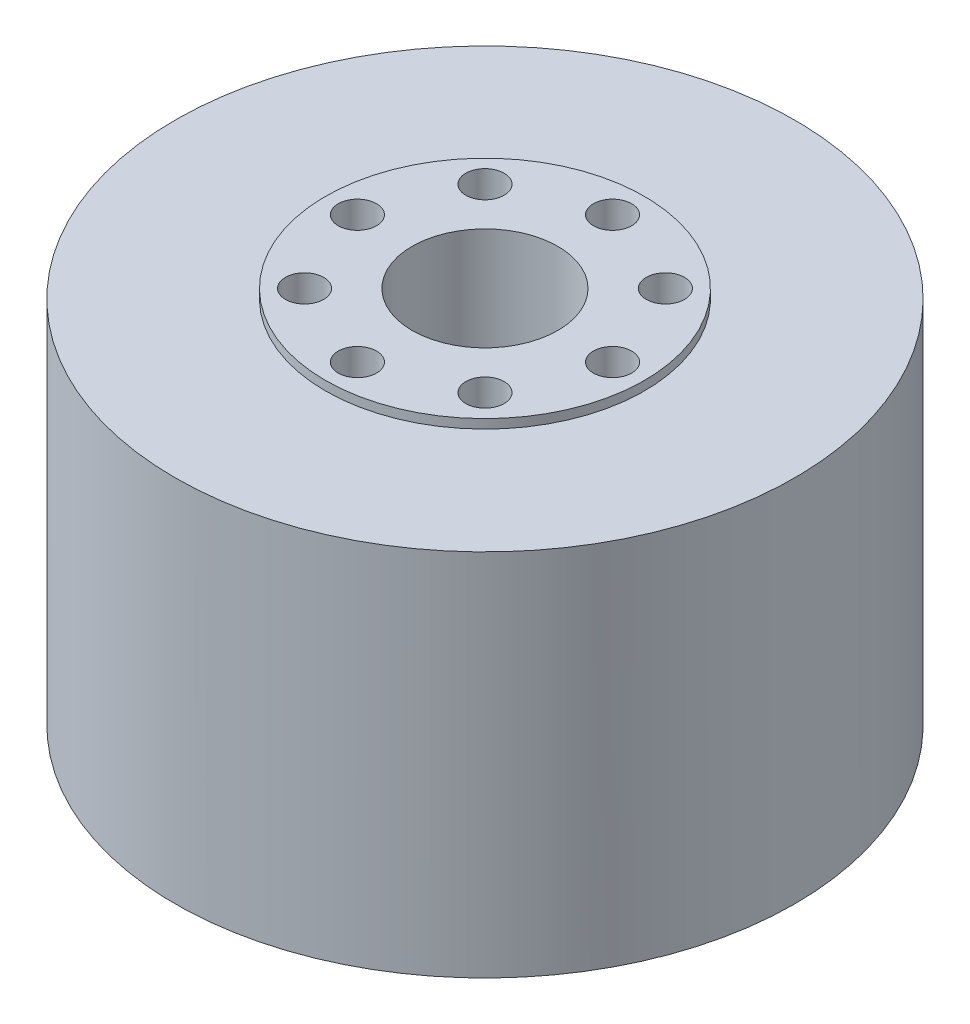
ISO-10303-21;
HEADER;
FILE_DESCRIPTION(('STEP AP214'),'2;1');
FILE_NAME('part.step','',(''),(''),'','','');
FILE_SCHEMA(('AUTOMOTIVE_DESIGN { 1 0 10303 214 1 1 1 1 }'));
ENDSEC;
DATA;
#1=APPLICATION_CONTEXT('core data for automotive mechanical design processes');
#2=APPLICATION_PROTOCOL_DEFINITION('international standard','automotive_design',2000,#1);
#3=PRODUCT_CONTEXT('',#1,'mechanical');
#4=PRODUCT('Part','Part','',(#3));
#5=PRODUCT_RELATED_PRODUCT_CATEGORY('part','',(#4));
#6=PRODUCT_DEFINITION_FORMATION('','',#4);
#7=PRODUCT_DEFINITION_CONTEXT('part definition',#1,'design');
#8=PRODUCT_DEFINITION('design','',#6,#7);
#9=PRODUCT_DEFINITION_SHAPE('','',#8);
#10=(LENGTH_UNIT() NAMED_UNIT(*) SI_UNIT(.MILLI.,.METRE.));
#11=(NAMED_UNIT(*) PLANE_ANGLE_UNIT() SI_UNIT($,.RADIAN.));
#12=(NAMED_UNIT(*) SI_UNIT($,.STERADIAN.) SOLID_ANGLE_UNIT());
#13=UNCERTAINTY_MEASURE_WITH_UNIT(LENGTH_MEASURE(1.E-05),#10,'distance_accuracy_value','');
#14=(GEOMETRIC_REPRESENTATION_CONTEXT(3) GLOBAL_UNCERTAINTY_ASSIGNED_CONTEXT((#13)) GLOBAL_UNIT_ASSIGNED_CONTEXT((#10,
#11,#12)) REPRESENTATION_CONTEXT('',''));
#15=CARTESIAN_POINT('',(0.,0.,0.));
#16=DIRECTION('',(0.,0.,1.));
#17=DIRECTION('',(1.,0.,0.));
#18=AXIS2_PLACEMENT_3D('',#15,#16,#17);
#19=CARTESIAN_POINT('',(0.,40.5,0.));
#20=DIRECTION('',(0.,1.,0.));
#21=DIRECTION('',(0.,0.,1.));
#22=AXIS2_PLACEMENT_3D('',#19,#20,#21);
#23=PLANE('',#22);
#24=CARTESIAN_POINT('',(0.,40.5,0.));
#25=DIRECTION('',(0.,1.,0.));
#26=DIRECTION('',(0.,0.,1.));
#27=AXIS2_PLACEMENT_3D('',#24,#25,#26);
#28=CIRCLE('',#27,34.);
#29=CARTESIAN_POINT('',(0.,40.5,34.));
#30=VERTEX_POINT('',#29);
#31=EDGE_CURVE('E11',#30,#30,#28,.T.);
#32=ORIENTED_EDGE('',*,*,#31,.T.);
#33=EDGE_LOOP('',(#32));
#34=FACE_BOUND('',#33,.T.);
#35=CARTESIAN_POINT('',(0.,40.5,0.));
#36=DIRECTION('',(0.,1.,0.));
#37=DIRECTION('',(0.,0.,1.));
#38=AXIS2_PLACEMENT_3D('',#35,#36,#37);
#39=CIRCLE('',#38,17.5);
#40=CARTESIAN_POINT('',(0.,40.5,17.5));
#41=VERTEX_POINT('',#40);
#42=EDGE_CURVE('E83',#41,#41,#39,.T.);
#43=ORIENTED_EDGE('',*,*,#42,.F.);
#44=EDGE_LOOP('',(#43));
#45=FACE_BOUND('',#44,.T.);
#46=ADVANCED_FACE('F36',(#34,#45),#23,.T.);
#47=CARTESIAN_POINT('',(0.,0.,0.));
#48=DIRECTION('',(0.,1.,0.));
#49=DIRECTION('',(0.,0.,1.));
#50=AXIS2_PLACEMENT_3D('',#47,#48,#49);
#51=PLANE('',#50);
#52=CARTESIAN_POINT('',(30.,0.,0.));
#53=DIRECTION('',(0.,-1.,0.));
#54=DIRECTION('',(0.,0.,-1.));
#55=AXIS2_PLACEMENT_3D('',#52,#53,#54);
#56=CIRCLE('',#55,2.1);
#57=CARTESIAN_POINT('',(30.,0.,-2.1));
#58=VERTEX_POINT('',#57);
#59=EDGE_CURVE('E154',#58,#58,#56,.T.);
#60=ORIENTED_EDGE('',*,*,#59,.F.);
#61=EDGE_LOOP('',(#60));
#62=FACE_BOUND('',#61,.T.);
#63=CARTESIAN_POINT('',(-15.,0.,-25.9807621135332));
#64=DIRECTION('',(0.,-1.,0.));
#65=DIRECTION('',(0.,0.,-1.));
#66=AXIS2_PLACEMENT_3D('',#63,#64,#65);
#67=CIRCLE('',#66,2.1);
#68=CARTESIAN_POINT('',(-15.,0.,-28.0807621135332));
#69=VERTEX_POINT('',#68);
#70=EDGE_CURVE('E148',#69,#69,#67,.T.);
#71=ORIENTED_EDGE('',*,*,#70,.F.);
#72=EDGE_LOOP('',(#71));
#73=FACE_BOUND('',#72,.T.);
#74=CARTESIAN_POINT('',(-15.,0.,25.9807621135332));
#75=DIRECTION('',(0.,-1.,0.));
#76=DIRECTION('',(0.,0.,-1.));
#77=AXIS2_PLACEMENT_3D('',#74,#75,#76);
#78=CIRCLE('',#77,2.1);
#79=CARTESIAN_POINT('',(-15.,0.,23.8807621135332));
#80=VERTEX_POINT('',#79);
#81=EDGE_CURVE('E142',#80,#80,#78,.T.);
#82=ORIENTED_EDGE('',*,*,#81,.F.);
#83=EDGE_LOOP('',(#82));
#84=FACE_BOUND('',#83,.T.);
#85=CARTESIAN_POINT('',(0.,0.,0.));
#86=DIRECTION('',(0.,1.,0.));
#87=DIRECTION('',(0.,0.,1.));
#88=AXIS2_PLACEMENT_3D('',#85,#86,#87);
#89=CIRCLE('',#88,34.);
#90=CARTESIAN_POINT('',(-28.8444102037119,0.,18.));
#91=VERTEX_POINT('',#90);
#92=CARTESIAN_POINT('',(-28.8444102037119,0.,-18.));
#93=VERTEX_POINT('',#92);
#94=EDGE_CURVE('E40',#91,#93,#89,.T.);
#95=ORIENTED_EDGE('',*,*,#94,.F.);
#96=DIRECTION('',(0.,0.,1.));
#97=VECTOR('',#96,1.);
#98=CARTESIAN_POINT('',(-28.8444102037119,0.,0.));
#99=LINE('',#98,#97);
#100=EDGE_CURVE('E60',#93,#91,#99,.T.);
#101=ORIENTED_EDGE('',*,*,#100,.F.);
#102=EDGE_LOOP('',(#95,#101));
#103=FACE_BOUND('',#102,.T.);
#104=CARTESIAN_POINT('',(0.,0.,0.));
#105=DIRECTION('',(0.,1.,0.));
#106=DIRECTION('',(0.,0.,1.));
#107=AXIS2_PLACEMENT_3D('',#104,#105,#106);
#108=CIRCLE('',#107,8.);
#109=CARTESIAN_POINT('',(0.,0.,8.));
#110=VERTEX_POINT('',#109);
#111=EDGE_CURVE('E77',#110,#110,#108,.T.);
#112=ORIENTED_EDGE('',*,*,#111,.T.);
#113=EDGE_LOOP('',(#112));
#114=FACE_BOUND('',#113,.T.);
#115=ADVANCED_FACE('F75',(#62,#73,#84,#103,#114),#51,.F.);
#116=CARTESIAN_POINT('',(0.,40.5,0.));
#117=DIRECTION('',(0.,-1.,0.));
#118=DIRECTION('',(0.,0.,-1.));
#119=AXIS2_PLACEMENT_3D('',#116,#117,#118);
#120=CYLINDRICAL_SURFACE('',#119,34.);
#121=ORIENTED_EDGE('',*,*,#31,.F.);
#122=EDGE_LOOP('',(#121));
#123=FACE_BOUND('',#122,.T.);
#124=CARTESIAN_POINT('',(0.,8.,0.));
#125=DIRECTION('',(0.,-1.,0.));
#126=DIRECTION('',(0.,0.,-1.));
#127=AXIS2_PLACEMENT_3D('',#124,#125,#126);
#128=CIRCLE('',#127,34.);
#129=CARTESIAN_POINT('',(-28.8444102037119,8.,18.));
#130=VERTEX_POINT('',#129);
#131=CARTESIAN_POINT('',(-28.8444102037119,8.,-18.));
#132=VERTEX_POINT('',#131);
#133=EDGE_CURVE('E73',#130,#132,#128,.T.);
#134=ORIENTED_EDGE('',*,*,#133,.F.);
#135=DIRECTION('',(0.,-1.,0.));
#136=VECTOR('',#135,1.);
#137=CARTESIAN_POINT('',(-28.8444102037119,8.,18.));
#138=LINE('',#137,#136);
#139=EDGE_CURVE('E63',#130,#91,#138,.T.);
#140=ORIENTED_EDGE('',*,*,#139,.T.);
#141=ORIENTED_EDGE('',*,*,#94,.T.);
#142=DIRECTION('',(0.,-1.,0.));
#143=VECTOR('',#142,1.);
#144=CARTESIAN_POINT('',(-28.8444102037119,8.,-18.));
#145=LINE('',#144,#143);
#146=EDGE_CURVE('E66',#132,#93,#145,.T.);
#147=ORIENTED_EDGE('',*,*,#146,.F.);
#148=EDGE_LOOP('',(#134,#140,#141,#147));
#149=FACE_BOUND('',#148,.T.);
#150=ADVANCED_FACE('F38',(#123,#149),#120,.T.);
#151=CARTESIAN_POINT('',(0.,40.5,0.));
#152=DIRECTION('',(0.,-1.,0.));
#153=DIRECTION('',(0.,0.,-1.));
#154=AXIS2_PLACEMENT_3D('',#151,#152,#153);
#155=CYLINDRICAL_SURFACE('',#154,8.);
#156=ORIENTED_EDGE('',*,*,#111,.F.);
#157=EDGE_LOOP('',(#156));
#158=FACE_BOUND('',#157,.T.);
#159=CARTESIAN_POINT('',(0.,41.5,0.));
#160=DIRECTION('',(0.,1.,0.));
#161=DIRECTION('',(0.,0.,1.));
#162=AXIS2_PLACEMENT_3D('',#159,#160,#161);
#163=CIRCLE('',#162,8.);
#164=CARTESIAN_POINT('',(0.,41.5,8.));
#165=VERTEX_POINT('',#164);
#166=EDGE_CURVE('E87',#165,#165,#163,.T.);
#167=ORIENTED_EDGE('',*,*,#166,.T.);
#168=EDGE_LOOP('',(#167));
#169=FACE_BOUND('',#168,.T.);
#170=ADVANCED_FACE('F197',(#158,#169),#155,.F.);
#171=CARTESIAN_POINT('',(0.,41.5,0.));
#172=DIRECTION('',(0.,1.,0.));
#173=DIRECTION('',(0.,0.,1.));
#174=AXIS2_PLACEMENT_3D('',#171,#172,#173);
#175=PLANE('',#174);
#176=CARTESIAN_POINT('',(9.89949493661179,41.5,-9.89949493661154));
#177=DIRECTION('',(0.,1.,0.));
#178=DIRECTION('',(0.,0.,1.));
#179=AXIS2_PLACEMENT_3D('',#176,#177,#178);
#180=CIRCLE('',#179,2.1);
#181=CARTESIAN_POINT('',(9.89949493661179,41.5,-7.79949493661155));
#182=VERTEX_POINT('',#181);
#183=EDGE_CURVE('E98',#182,#182,#180,.T.);
#184=ORIENTED_EDGE('',*,*,#183,.F.);
#185=EDGE_LOOP('',(#184));
#186=FACE_BOUND('',#185,.T.);
#187=CARTESIAN_POINT('',(1.46642216231412E-13,41.5,-14.));
#188=DIRECTION('',(0.,1.,0.));
#189=DIRECTION('',(0.,0.,1.));
#190=AXIS2_PLACEMENT_3D('',#187,#188,#189);
#191=CIRCLE('',#190,2.1);
#192=CARTESIAN_POINT('',(1.46642216231412E-13,41.5,-11.9));
#193=VERTEX_POINT('',#192);
#194=EDGE_CURVE('E104',#193,#193,#191,.T.);
#195=ORIENTED_EDGE('',*,*,#194,.F.);
#196=EDGE_LOOP('',(#195));
#197=FACE_BOUND('',#196,.T.);
#198=CARTESIAN_POINT('',(-9.89949493661158,41.5,-9.89949493661176));
#199=DIRECTION('',(0.,1.,0.));
#200=DIRECTION('',(0.,0.,1.));
#201=AXIS2_PLACEMENT_3D('',#198,#199,#200);
#202=CIRCLE('',#201,2.1);
#203=CARTESIAN_POINT('',(-9.89949493661158,41.5,-7.79949493661176));
#204=VERTEX_POINT('',#203);
#205=EDGE_CURVE('E110',#204,#204,#202,.T.);
#206=ORIENTED_EDGE('',*,*,#205,.F.);
#207=EDGE_LOOP('',(#206));
#208=FACE_BOUND('',#207,.T.);
#209=CARTESIAN_POINT('',(-14.,41.5,0.));
#210=DIRECTION('',(0.,1.,0.));
#211=DIRECTION('',(0.,0.,1.));
#212=AXIS2_PLACEMENT_3D('',#209,#210,#211);
#213=CIRCLE('',#212,2.1);
#214=CARTESIAN_POINT('',(-14.,41.5,2.0999999999999));
#215=VERTEX_POINT('',#214);
#216=EDGE_CURVE('E116',#215,#215,#213,.T.);
#217=ORIENTED_EDGE('',*,*,#216,.F.);
#218=EDGE_LOOP('',(#217));
#219=FACE_BOUND('',#218,.T.);
#220=CARTESIAN_POINT('',(-9.89949493661171,41.5,9.89949493661161));
#221=DIRECTION('',(0.,1.,0.));
#222=DIRECTION('',(0.,0.,1.));
#223=AXIS2_PLACEMENT_3D('',#220,#221,#222);
#224=CIRCLE('',#223,2.1);
#225=CARTESIAN_POINT('',(-9.89949493661171,41.5,11.9994949366116));
#226=VERTEX_POINT('',#225);
#227=EDGE_CURVE('E122',#226,#226,#224,.T.);
#228=ORIENTED_EDGE('',*,*,#227,.F.);
#229=EDGE_LOOP('',(#228));
#230=FACE_BOUND('',#229,.T.);
#231=CARTESIAN_POINT('',(0.,41.5,14.));
#232=DIRECTION('',(0.,1.,0.));
#233=DIRECTION('',(0.,0.,1.));
#234=AXIS2_PLACEMENT_3D('',#231,#232,#233);
#235=CIRCLE('',#234,2.1);
#236=CARTESIAN_POINT('',(0.,41.5,16.1));
#237=VERTEX_POINT('',#236);
#238=EDGE_CURVE('E128',#237,#237,#235,.T.);
#239=ORIENTED_EDGE('',*,*,#238,.F.);
#240=EDGE_LOOP('',(#239));
#241=FACE_BOUND('',#240,.T.);
#242=CARTESIAN_POINT('',(9.89949493661165,41.5,9.89949493661168));
#243=DIRECTION('',(0.,1.,0.));
#244=DIRECTION('',(0.,0.,1.));
#245=AXIS2_PLACEMENT_3D('',#242,#243,#244);
#246=CIRCLE('',#245,2.1);
#247=CARTESIAN_POINT('',(9.89949493661165,41.5,11.9994949366117));
#248=VERTEX_POINT('',#247);
#249=EDGE_CURVE('E134',#248,#248,#246,.T.);
#250=ORIENTED_EDGE('',*,*,#249,.F.);
#251=EDGE_LOOP('',(#250));
#252=FACE_BOUND('',#251,.T.);
#253=CARTESIAN_POINT('',(14.,41.5,0.));
#254=DIRECTION('',(0.,1.,0.));
#255=DIRECTION('',(0.,0.,1.));
#256=AXIS2_PLACEMENT_3D('',#253,#254,#255);
#257=CIRCLE('',#256,2.1);
#258=CARTESIAN_POINT('',(14.,41.5,2.1));
#259=VERTEX_POINT('',#258);
#260=EDGE_CURVE('E92',#259,#259,#257,.T.);
#261=ORIENTED_EDGE('',*,*,#260,.F.);
#262=EDGE_LOOP('',(#261));
#263=FACE_BOUND('',#262,.T.);
#264=CARTESIAN_POINT('',(0.,41.5,0.));
#265=DIRECTION('',(0.,1.,0.));
#266=DIRECTION('',(0.,0.,1.));
#267=AXIS2_PLACEMENT_3D('',#264,#265,#266);
#268=CIRCLE('',#267,17.5);
#269=CARTESIAN_POINT('',(0.,41.5,17.5));
#270=VERTEX_POINT('',#269);
#271=EDGE_CURVE('E79',#270,#270,#268,.T.);
#272=ORIENTED_EDGE('',*,*,#271,.T.);
#273=EDGE_LOOP('',(#272));
#274=FACE_BOUND('',#273,.T.);
#275=ORIENTED_EDGE('',*,*,#166,.F.);
#276=EDGE_LOOP('',(#275));
#277=FACE_BOUND('',#276,.T.);
#278=ADVANCED_FACE('F200',(#186,#197,#208,#219,#230,#241,#252,#263,#274,#277),#175,.T.);
#279=CARTESIAN_POINT('',(0.,41.5,0.));
#280=DIRECTION('',(0.,-1.,0.));
#281=DIRECTION('',(0.,0.,-1.));
#282=AXIS2_PLACEMENT_3D('',#279,#280,#281);
#283=CYLINDRICAL_SURFACE('',#282,17.5);
#284=ORIENTED_EDGE('',*,*,#271,.F.);
#285=EDGE_LOOP('',(#284));
#286=FACE_BOUND('',#285,.T.);
#287=ORIENTED_EDGE('',*,*,#42,.T.);
#288=EDGE_LOOP('',(#287));
#289=FACE_BOUND('',#288,.T.);
#290=ADVANCED_FACE('F202',(#286,#289),#283,.T.);
#291=CARTESIAN_POINT('',(14.,36.5,0.));
#292=DIRECTION('',(0.,1.,0.));
#293=DIRECTION('',(0.,0.,1.));
#294=AXIS2_PLACEMENT_3D('',#291,#292,#293);
#295=CYLINDRICAL_SURFACE('',#294,2.1);
#296=CARTESIAN_POINT('',(14.,36.5,0.));
#297=DIRECTION('',(0.,1.,0.));
#298=DIRECTION('',(0.,0.,1.));
#299=AXIS2_PLACEMENT_3D('',#296,#297,#298);
#300=CIRCLE('',#299,2.1);
#301=CARTESIAN_POINT('',(14.,36.5,2.1));
#302=VERTEX_POINT('',#301);
#303=EDGE_CURVE('E91',#302,#302,#300,.T.);
#304=ORIENTED_EDGE('',*,*,#303,.F.);
#305=EDGE_LOOP('',(#304));
#306=FACE_BOUND('',#305,.T.);
#307=ORIENTED_EDGE('',*,*,#260,.T.);
#308=EDGE_LOOP('',(#307));
#309=FACE_BOUND('',#308,.T.);
#310=ADVANCED_FACE('F205',(#306,#309),#295,.F.);
#311=CARTESIAN_POINT('',(14.,36.5,0.));
#312=DIRECTION('',(0.,1.,0.));
#313=DIRECTION('',(0.,0.,1.));
#314=AXIS2_PLACEMENT_3D('',#311,#312,#313);
#315=PLANE('',#314);
#316=ORIENTED_EDGE('',*,*,#303,.T.);
#317=EDGE_LOOP('',(#316));
#318=FACE_BOUND('',#317,.T.);
#319=ADVANCED_FACE('F212',(#318),#315,.T.);
#320=CARTESIAN_POINT('',(9.89949493661165,36.5,9.89949493661168));
#321=DIRECTION('',(0.,1.,0.));
#322=DIRECTION('',(0.,0.,1.));
#323=AXIS2_PLACEMENT_3D('',#320,#321,#322);
#324=CYLINDRICAL_SURFACE('',#323,2.1);
#325=CARTESIAN_POINT('',(9.89949493661165,36.5,9.89949493661168));
#326=DIRECTION('',(0.,1.,0.));
#327=DIRECTION('',(0.,0.,1.));
#328=AXIS2_PLACEMENT_3D('',#325,#326,#327);
#329=CIRCLE('',#328,2.1);
#330=CARTESIAN_POINT('',(9.89949493661165,36.5,11.9994949366117));
#331=VERTEX_POINT('',#330);
#332=EDGE_CURVE('E95',#331,#331,#329,.T.);
#333=ORIENTED_EDGE('',*,*,#332,.F.);
#334=EDGE_LOOP('',(#333));
#335=FACE_BOUND('',#334,.T.);
#336=ORIENTED_EDGE('',*,*,#249,.T.);
#337=EDGE_LOOP('',(#336));
#338=FACE_BOUND('',#337,.T.);
#339=ADVANCED_FACE('F216',(#335,#338),#324,.F.);
#340=CARTESIAN_POINT('',(9.89949493661165,36.5,9.89949493661168));
#341=DIRECTION('',(0.,1.,0.));
#342=DIRECTION('',(0.,0.,1.));
#343=AXIS2_PLACEMENT_3D('',#340,#341,#342);
#344=PLANE('',#343);
#345=ORIENTED_EDGE('',*,*,#332,.T.);
#346=EDGE_LOOP('',(#345));
#347=FACE_BOUND('',#346,.T.);
#348=ADVANCED_FACE('F262',(#347),#344,.T.);
#349=CARTESIAN_POINT('',(0.,36.5,14.));
#350=DIRECTION('',(0.,1.,0.));
#351=DIRECTION('',(0.,0.,1.));
#352=AXIS2_PLACEMENT_3D('',#349,#350,#351);
#353=CYLINDRICAL_SURFACE('',#352,2.1);
#354=CARTESIAN_POINT('',(0.,36.5,14.));
#355=DIRECTION('',(0.,1.,0.));
#356=DIRECTION('',(0.,0.,1.));
#357=AXIS2_PLACEMENT_3D('',#354,#355,#356);
#358=CIRCLE('',#357,2.1);
#359=CARTESIAN_POINT('',(0.,36.5,16.1));
#360=VERTEX_POINT('',#359);
#361=EDGE_CURVE('E131',#360,#360,#358,.T.);
#362=ORIENTED_EDGE('',*,*,#361,.F.);
#363=EDGE_LOOP('',(#362));
#364=FACE_BOUND('',#363,.T.);
#365=ORIENTED_EDGE('',*,*,#238,.T.);
#366=EDGE_LOOP('',(#365));
#367=FACE_BOUND('',#366,.T.);
#368=ADVANCED_FACE('F259',(#364,#367),#353,.F.);
#369=CARTESIAN_POINT('',(0.,36.5,14.));
#370=DIRECTION('',(0.,1.,0.));
#371=DIRECTION('',(0.,0.,1.));
#372=AXIS2_PLACEMENT_3D('',#369,#370,#371);
#373=PLANE('',#372);
#374=ORIENTED_EDGE('',*,*,#361,.T.);
#375=EDGE_LOOP('',(#374));
#376=FACE_BOUND('',#375,.T.);
#377=ADVANCED_FACE('F254',(#376),#373,.T.);
#378=CARTESIAN_POINT('',(-9.89949493661171,36.5,9.89949493661161));
#379=DIRECTION('',(0.,1.,0.));
#380=DIRECTION('',(0.,0.,1.));
#381=AXIS2_PLACEMENT_3D('',#378,#379,#380);
#382=CYLINDRICAL_SURFACE('',#381,2.1);
#383=CARTESIAN_POINT('',(-9.89949493661171,36.5,9.89949493661161));
#384=DIRECTION('',(0.,1.,0.));
#385=DIRECTION('',(0.,0.,1.));
#386=AXIS2_PLACEMENT_3D('',#383,#384,#385);
#387=CIRCLE('',#386,2.1);
#388=CARTESIAN_POINT('',(-9.89949493661171,36.5,11.9994949366116));
#389=VERTEX_POINT('',#388);
#390=EDGE_CURVE('E125',#389,#389,#387,.T.);
#391=ORIENTED_EDGE('',*,*,#390,.F.);
#392=EDGE_LOOP('',(#391));
#393=FACE_BOUND('',#392,.T.);
#394=ORIENTED_EDGE('',*,*,#227,.T.);
#395=EDGE_LOOP('',(#394));
#396=FACE_BOUND('',#395,.T.);
#397=ADVANCED_FACE('F251',(#393,#396),#382,.F.);
#398=CARTESIAN_POINT('',(-9.89949493661171,36.5,9.89949493661161));
#399=DIRECTION('',(0.,1.,0.));
#400=DIRECTION('',(0.,0.,1.));
#401=AXIS2_PLACEMENT_3D('',#398,#399,#400);
#402=PLANE('',#401);
#403=ORIENTED_EDGE('',*,*,#390,.T.);
#404=EDGE_LOOP('',(#403));
#405=FACE_BOUND('',#404,.T.);
#406=ADVANCED_FACE('F246',(#405),#402,.T.);
#407=CARTESIAN_POINT('',(-14.,36.5,0.));
#408=DIRECTION('',(0.,1.,0.));
#409=DIRECTION('',(0.,0.,1.));
#410=AXIS2_PLACEMENT_3D('',#407,#408,#409);
#411=CYLINDRICAL_SURFACE('',#410,2.1);
#412=CARTESIAN_POINT('',(-14.,36.5,0.));
#413=DIRECTION('',(0.,1.,0.));
#414=DIRECTION('',(0.,0.,1.));
#415=AXIS2_PLACEMENT_3D('',#412,#413,#414);
#416=CIRCLE('',#415,2.1);
#417=CARTESIAN_POINT('',(-14.,36.5,2.0999999999999));
#418=VERTEX_POINT('',#417);
#419=EDGE_CURVE('E119',#418,#418,#416,.T.);
#420=ORIENTED_EDGE('',*,*,#419,.F.);
#421=EDGE_LOOP('',(#420));
#422=FACE_BOUND('',#421,.T.);
#423=ORIENTED_EDGE('',*,*,#216,.T.);
#424=EDGE_LOOP('',(#423));
#425=FACE_BOUND('',#424,.T.);
#426=ADVANCED_FACE('F243',(#422,#425),#411,.F.);
#427=CARTESIAN_POINT('',(-14.,36.5,0.));
#428=DIRECTION('',(0.,1.,0.));
#429=DIRECTION('',(0.,0.,1.));
#430=AXIS2_PLACEMENT_3D('',#427,#428,#429);
#431=PLANE('',#430);
#432=ORIENTED_EDGE('',*,*,#419,.T.);
#433=EDGE_LOOP('',(#432));
#434=FACE_BOUND('',#433,.T.);
#435=ADVANCED_FACE('F238',(#434),#431,.T.);
#436=CARTESIAN_POINT('',(-9.89949493661158,36.5,-9.89949493661176));
#437=DIRECTION('',(0.,1.,0.));
#438=DIRECTION('',(0.,0.,1.));
#439=AXIS2_PLACEMENT_3D('',#436,#437,#438);
#440=CYLINDRICAL_SURFACE('',#439,2.1);
#441=CARTESIAN_POINT('',(-9.89949493661158,36.5,-9.89949493661176));
#442=DIRECTION('',(0.,1.,0.));
#443=DIRECTION('',(0.,0.,1.));
#444=AXIS2_PLACEMENT_3D('',#441,#442,#443);
#445=CIRCLE('',#444,2.1);
#446=CARTESIAN_POINT('',(-9.89949493661158,36.5,-7.79949493661176));
#447=VERTEX_POINT('',#446);
#448=EDGE_CURVE('E113',#447,#447,#445,.T.);
#449=ORIENTED_EDGE('',*,*,#448,.F.);
#450=EDGE_LOOP('',(#449));
#451=FACE_BOUND('',#450,.T.);
#452=ORIENTED_EDGE('',*,*,#205,.T.);
#453=EDGE_LOOP('',(#452));
#454=FACE_BOUND('',#453,.T.);
#455=ADVANCED_FACE('F235',(#451,#454),#440,.F.);
#456=CARTESIAN_POINT('',(-9.89949493661158,36.5,-9.89949493661176));
#457=DIRECTION('',(0.,1.,0.));
#458=DIRECTION('',(0.,0.,1.));
#459=AXIS2_PLACEMENT_3D('',#456,#457,#458);
#460=PLANE('',#459);
#461=ORIENTED_EDGE('',*,*,#448,.T.);
#462=EDGE_LOOP('',(#461));
#463=FACE_BOUND('',#462,.T.);
#464=ADVANCED_FACE('F230',(#463),#460,.T.);
#465=CARTESIAN_POINT('',(1.46642216231412E-13,36.5,-14.));
#466=DIRECTION('',(0.,1.,0.));
#467=DIRECTION('',(0.,0.,1.));
#468=AXIS2_PLACEMENT_3D('',#465,#466,#467);
#469=CYLINDRICAL_SURFACE('',#468,2.1);
#470=CARTESIAN_POINT('',(1.46642216231412E-13,36.5,-14.));
#471=DIRECTION('',(0.,1.,0.));
#472=DIRECTION('',(0.,0.,1.));
#473=AXIS2_PLACEMENT_3D('',#470,#471,#472);
#474=CIRCLE('',#473,2.1);
#475=CARTESIAN_POINT('',(1.46642216231412E-13,36.5,-11.9));
#476=VERTEX_POINT('',#475);
#477=EDGE_CURVE('E107',#476,#476,#474,.T.);
#478=ORIENTED_EDGE('',*,*,#477,.F.);
#479=EDGE_LOOP('',(#478));
#480=FACE_BOUND('',#479,.T.);
#481=ORIENTED_EDGE('',*,*,#194,.T.);
#482=EDGE_LOOP('',(#481));
#483=FACE_BOUND('',#482,.T.);
#484=ADVANCED_FACE('F227',(#480,#483),#469,.F.);
#485=CARTESIAN_POINT('',(1.46642216231412E-13,36.5,-14.));
#486=DIRECTION('',(0.,1.,0.));
#487=DIRECTION('',(0.,0.,1.));
#488=AXIS2_PLACEMENT_3D('',#485,#486,#487);
#489=PLANE('',#488);
#490=ORIENTED_EDGE('',*,*,#477,.T.);
#491=EDGE_LOOP('',(#490));
#492=FACE_BOUND('',#491,.T.);
#493=ADVANCED_FACE('F222',(#492),#489,.T.);
#494=CARTESIAN_POINT('',(9.89949493661179,36.5,-9.89949493661154));
#495=DIRECTION('',(0.,1.,0.));
#496=DIRECTION('',(0.,0.,1.));
#497=AXIS2_PLACEMENT_3D('',#494,#495,#496);
#498=CYLINDRICAL_SURFACE('',#497,2.1);
#499=CARTESIAN_POINT('',(9.89949493661179,36.5,-9.89949493661154));
#500=DIRECTION('',(0.,1.,0.));
#501=DIRECTION('',(0.,0.,1.));
#502=AXIS2_PLACEMENT_3D('',#499,#500,#501);
#503=CIRCLE('',#502,2.1);
#504=CARTESIAN_POINT('',(9.89949493661179,36.5,-7.79949493661155));
#505=VERTEX_POINT('',#504);
#506=EDGE_CURVE('E101',#505,#505,#503,.T.);
#507=ORIENTED_EDGE('',*,*,#506,.F.);
#508=EDGE_LOOP('',(#507));
#509=FACE_BOUND('',#508,.T.);
#510=ORIENTED_EDGE('',*,*,#183,.T.);
#511=EDGE_LOOP('',(#510));
#512=FACE_BOUND('',#511,.T.);
#513=ADVANCED_FACE('F218',(#509,#512),#498,.F.);
#514=CARTESIAN_POINT('',(9.89949493661179,36.5,-9.89949493661154));
#515=DIRECTION('',(0.,1.,0.));
#516=DIRECTION('',(0.,0.,1.));
#517=AXIS2_PLACEMENT_3D('',#514,#515,#516);
#518=PLANE('',#517);
#519=ORIENTED_EDGE('',*,*,#506,.T.);
#520=EDGE_LOOP('',(#519));
#521=FACE_BOUND('',#520,.T.);
#522=ADVANCED_FACE('F221',(#521),#518,.T.);
#523=CARTESIAN_POINT('',(-28.8444102037119,8.,0.));
#524=DIRECTION('',(1.,0.,0.));
#525=DIRECTION('',(0.,0.,-1.));
#526=AXIS2_PLACEMENT_3D('',#523,#524,#525);
#527=PLANE('',#526);
#528=ORIENTED_EDGE('',*,*,#100,.T.);
#529=ORIENTED_EDGE('',*,*,#139,.F.);
#530=DIRECTION('',(0.,0.,1.));
#531=VECTOR('',#530,1.);
#532=CARTESIAN_POINT('',(-28.8444102037119,8.,0.));
#533=LINE('',#532,#531);
#534=EDGE_CURVE('E50',#132,#130,#533,.T.);
#535=ORIENTED_EDGE('',*,*,#534,.F.);
#536=ORIENTED_EDGE('',*,*,#146,.T.);
#537=EDGE_LOOP('',(#528,#529,#535,#536));
#538=FACE_BOUND('',#537,.T.);
#539=ADVANCED_FACE('F62',(#538),#527,.F.);
#540=CARTESIAN_POINT('',(0.,8.,0.));
#541=DIRECTION('',(0.,-1.,0.));
#542=DIRECTION('',(0.,0.,-1.));
#543=AXIS2_PLACEMENT_3D('',#540,#541,#542);
#544=PLANE('',#543);
#545=ORIENTED_EDGE('',*,*,#534,.T.);
#546=ORIENTED_EDGE('',*,*,#133,.T.);
#547=EDGE_LOOP('',(#545,#546));
#548=FACE_BOUND('',#547,.T.);
#549=ADVANCED_FACE('F178',(#548),#544,.T.);
#550=CARTESIAN_POINT('',(-15.,5.,25.9807621135332));
#551=DIRECTION('',(0.,-1.,0.));
#552=DIRECTION('',(0.,0.,-1.));
#553=AXIS2_PLACEMENT_3D('',#550,#551,#552);
#554=CYLINDRICAL_SURFACE('',#553,2.1);
#555=CARTESIAN_POINT('',(-15.,5.,25.9807621135332));
#556=DIRECTION('',(0.,-1.,0.));
#557=DIRECTION('',(0.,0.,-1.));
#558=AXIS2_PLACEMENT_3D('',#555,#556,#557);
#559=CIRCLE('',#558,2.1);
#560=CARTESIAN_POINT('',(-15.,5.,23.8807621135332));
#561=VERTEX_POINT('',#560);
#562=EDGE_CURVE('E145',#561,#561,#559,.T.);
#563=ORIENTED_EDGE('',*,*,#562,.F.);
#564=EDGE_LOOP('',(#563));
#565=FACE_BOUND('',#564,.T.);
#566=ORIENTED_EDGE('',*,*,#81,.T.);
#567=EDGE_LOOP('',(#566));
#568=FACE_BOUND('',#567,.T.);
#569=ADVANCED_FACE('F175',(#565,#568),#554,.F.);
#570=CARTESIAN_POINT('',(-15.,5.,25.9807621135332));
#571=DIRECTION('',(0.,-1.,0.));
#572=DIRECTION('',(0.,0.,-1.));
#573=AXIS2_PLACEMENT_3D('',#570,#571,#572);
#574=PLANE('',#573);
#575=ORIENTED_EDGE('',*,*,#562,.T.);
#576=EDGE_LOOP('',(#575));
#577=FACE_BOUND('',#576,.T.);
#578=ADVANCED_FACE('F177',(#577),#574,.T.);
#579=CARTESIAN_POINT('',(-15.,5.,-25.9807621135332));
#580=DIRECTION('',(0.,-1.,0.));
#581=DIRECTION('',(0.,0.,-1.));
#582=AXIS2_PLACEMENT_3D('',#579,#580,#581);
#583=CYLINDRICAL_SURFACE('',#582,2.1);
#584=CARTESIAN_POINT('',(-15.,5.,-25.9807621135332));
#585=DIRECTION('',(0.,-1.,0.));
#586=DIRECTION('',(0.,0.,-1.));
#587=AXIS2_PLACEMENT_3D('',#584,#585,#586);
#588=CIRCLE('',#587,2.1);
#589=CARTESIAN_POINT('',(-15.,5.,-28.0807621135332));
#590=VERTEX_POINT('',#589);
#591=EDGE_CURVE('E151',#590,#590,#588,.T.);
#592=ORIENTED_EDGE('',*,*,#591,.F.);
#593=EDGE_LOOP('',(#592));
#594=FACE_BOUND('',#593,.T.);
#595=ORIENTED_EDGE('',*,*,#70,.T.);
#596=EDGE_LOOP('',(#595));
#597=FACE_BOUND('',#596,.T.);
#598=ADVANCED_FACE('F185',(#594,#597),#583,.F.);
#599=CARTESIAN_POINT('',(-15.,5.,-25.9807621135332));
#600=DIRECTION('',(0.,-1.,0.));
#601=DIRECTION('',(0.,0.,-1.));
#602=AXIS2_PLACEMENT_3D('',#599,#600,#601);
#603=PLANE('',#602);
#604=ORIENTED_EDGE('',*,*,#591,.T.);
#605=EDGE_LOOP('',(#604));
#606=FACE_BOUND('',#605,.T.);
#607=ADVANCED_FACE('F165',(#606),#603,.T.);
#608=CARTESIAN_POINT('',(30.,5.,0.));
#609=DIRECTION('',(0.,-1.,0.));
#610=DIRECTION('',(0.,0.,-1.));
#611=AXIS2_PLACEMENT_3D('',#608,#609,#610);
#612=CYLINDRICAL_SURFACE('',#611,2.1);
#613=CARTESIAN_POINT('',(30.,5.,0.));
#614=DIRECTION('',(0.,-1.,0.));
#615=DIRECTION('',(0.,0.,-1.));
#616=AXIS2_PLACEMENT_3D('',#613,#614,#615);
#617=CIRCLE('',#616,2.1);
#618=CARTESIAN_POINT('',(30.,5.,-2.1));
#619=VERTEX_POINT('',#618);
#620=EDGE_CURVE('E70',#619,#619,#617,.T.);
#621=ORIENTED_EDGE('',*,*,#620,.F.);
#622=EDGE_LOOP('',(#621));
#623=FACE_BOUND('',#622,.T.);
#624=ORIENTED_EDGE('',*,*,#59,.T.);
#625=EDGE_LOOP('',(#624));
#626=FACE_BOUND('',#625,.T.);
#627=ADVANCED_FACE('F162',(#623,#626),#612,.F.);
#628=CARTESIAN_POINT('',(30.,5.,0.));
#629=DIRECTION('',(0.,-1.,0.));
#630=DIRECTION('',(0.,0.,-1.));
#631=AXIS2_PLACEMENT_3D('',#628,#629,#630);
#632=PLANE('',#631);
#633=ORIENTED_EDGE('',*,*,#620,.T.);
#634=EDGE_LOOP('',(#633));
#635=FACE_BOUND('',#634,.T.);
#636=ADVANCED_FACE('F160',(#635),#632,.T.);
#637=CLOSED_SHELL('',(#46,#115,#150,#170,#278,#290,#310,#319,#339,#348,#368,#377,#397,#406,#426,
#435,#455,#464,#484,#493,#513,#522,#539,#549,#569,#578,#598,#607,#627,#636));
#638=MANIFOLD_SOLID_BREP('B2',#637);
#639=ADVANCED_BREP_SHAPE_REPRESENTATION('',(#18,#638),#14);
#640=SHAPE_DEFINITION_REPRESENTATION(#9,#639);
ENDSEC;
END-ISO-10303-21;
